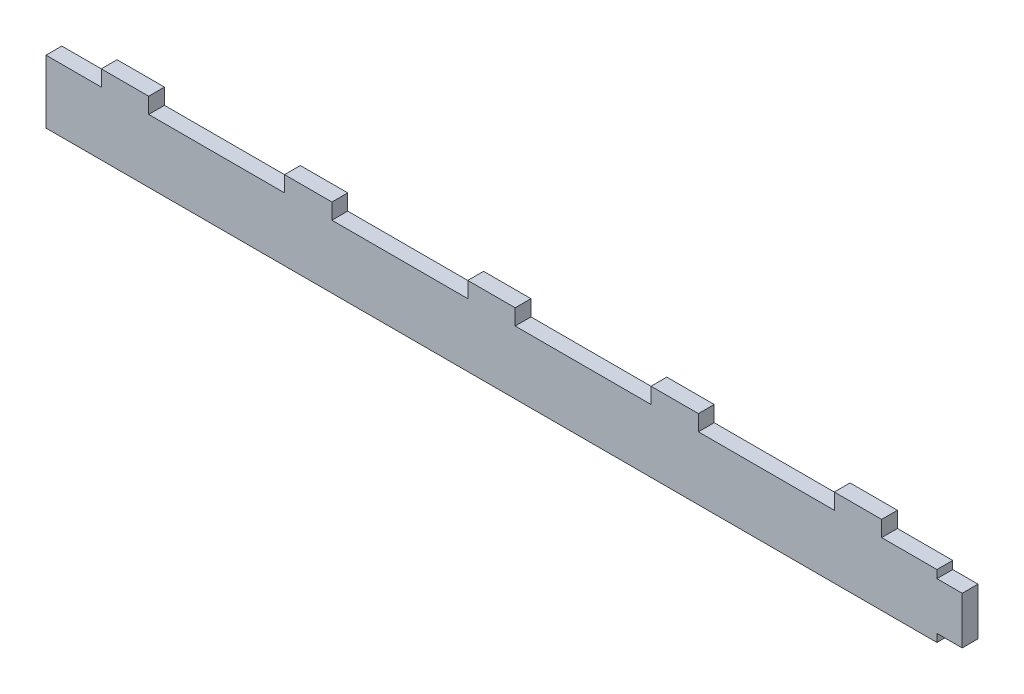
ISO-10303-21;
HEADER;
FILE_DESCRIPTION(('STEP AP214'),'2;1');
FILE_NAME('part.step','',(''),(''),'','','');
FILE_SCHEMA(('AUTOMOTIVE_DESIGN { 1 0 10303 214 1 1 1 1 }'));
ENDSEC;
DATA;
#1=APPLICATION_CONTEXT('core data for automotive mechanical design processes');
#2=APPLICATION_PROTOCOL_DEFINITION('international standard','automotive_design',2000,#1);
#3=PRODUCT_CONTEXT('',#1,'mechanical');
#4=PRODUCT('Part','Part','',(#3));
#5=PRODUCT_RELATED_PRODUCT_CATEGORY('part','',(#4));
#6=PRODUCT_DEFINITION_FORMATION('','',#4);
#7=PRODUCT_DEFINITION_CONTEXT('part definition',#1,'design');
#8=PRODUCT_DEFINITION('design','',#6,#7);
#9=PRODUCT_DEFINITION_SHAPE('','',#8);
#10=(LENGTH_UNIT() NAMED_UNIT(*) SI_UNIT(.MILLI.,.METRE.));
#11=(NAMED_UNIT(*) PLANE_ANGLE_UNIT() SI_UNIT($,.RADIAN.));
#12=(NAMED_UNIT(*) SI_UNIT($,.STERADIAN.) SOLID_ANGLE_UNIT());
#13=UNCERTAINTY_MEASURE_WITH_UNIT(LENGTH_MEASURE(1.E-05),#10,'distance_accuracy_value','');
#14=(GEOMETRIC_REPRESENTATION_CONTEXT(3) GLOBAL_UNCERTAINTY_ASSIGNED_CONTEXT((#13)) GLOBAL_UNIT_ASSIGNED_CONTEXT((#10,
#11,#12)) REPRESENTATION_CONTEXT('',''));
#15=CARTESIAN_POINT('',(0.,0.,0.));
#16=DIRECTION('',(0.,0.,1.));
#17=DIRECTION('',(1.,0.,0.));
#18=AXIS2_PLACEMENT_3D('',#15,#16,#17);
#19=CARTESIAN_POINT('',(0.,42.9416147491288,5.));
#20=DIRECTION('',(0.,1.,0.));
#21=DIRECTION('',(-1.,0.,0.));
#22=AXIS2_PLACEMENT_3D('',#19,#20,#21);
#23=PLANE('',#22);
#24=DIRECTION('',(1.,0.,0.));
#25=VECTOR('',#24,1.);
#26=CARTESIAN_POINT('',(0.,42.9416147491288,0.));
#27=LINE('',#26,#25);
#28=CARTESIAN_POINT('',(-109.795634555167,42.9416147491288,0.));
#29=VERTEX_POINT('',#28);
#30=CARTESIAN_POINT('',(172.204365444833,42.9416147491287,0.));
#31=VERTEX_POINT('',#30);
#32=EDGE_CURVE('E250',#29,#31,#27,.T.);
#33=ORIENTED_EDGE('',*,*,#32,.T.);
#34=DIRECTION('',(0.,0.,-1.));
#35=VECTOR('',#34,1.);
#36=CARTESIAN_POINT('',(172.204365444833,42.9416147491287,5.));
#37=LINE('',#36,#35);
#38=CARTESIAN_POINT('',(172.204365444833,42.9416147491287,5.));
#39=VERTEX_POINT('',#38);
#40=EDGE_CURVE('E11',#39,#31,#37,.T.);
#41=ORIENTED_EDGE('',*,*,#40,.F.);
#42=DIRECTION('',(1.,0.,0.));
#43=VECTOR('',#42,1.);
#44=CARTESIAN_POINT('',(0.,42.9416147491288,5.));
#45=LINE('',#44,#43);
#46=CARTESIAN_POINT('',(-109.795634555167,42.9416147491288,5.));
#47=VERTEX_POINT('',#46);
#48=EDGE_CURVE('E321',#47,#39,#45,.T.);
#49=ORIENTED_EDGE('',*,*,#48,.F.);
#50=DIRECTION('',(0.,0.,-1.));
#51=VECTOR('',#50,1.);
#52=CARTESIAN_POINT('',(-109.795634555167,42.9416147491288,5.));
#53=LINE('',#52,#51);
#54=EDGE_CURVE('E246',#47,#29,#53,.T.);
#55=ORIENTED_EDGE('',*,*,#54,.T.);
#56=EDGE_LOOP('',(#33,#41,#49,#55));
#57=FACE_BOUND('',#56,.T.);
#58=ADVANCED_FACE('F35',(#57),#23,.F.);
#59=CARTESIAN_POINT('',(172.204365444834,1.9118525145781E-12,5.));
#60=DIRECTION('',(-1.,0.,0.));
#61=DIRECTION('',(0.,-1.,0.));
#62=AXIS2_PLACEMENT_3D('',#59,#60,#61);
#63=PLANE('',#62);
#64=DIRECTION('',(0.,1.,0.));
#65=VECTOR('',#64,1.);
#66=CARTESIAN_POINT('',(172.204365444834,1.9118525145781E-12,0.));
#67=LINE('',#66,#65);
#68=CARTESIAN_POINT('',(172.204365444833,45.4416147491288,0.));
#69=VERTEX_POINT('',#68);
#70=EDGE_CURVE('E253',#31,#69,#67,.T.);
#71=ORIENTED_EDGE('',*,*,#70,.T.);
#72=DIRECTION('',(0.,0.,-1.));
#73=VECTOR('',#72,1.);
#74=CARTESIAN_POINT('',(172.204365444833,45.4416147491288,5.));
#75=LINE('',#74,#73);
#76=CARTESIAN_POINT('',(172.204365444833,45.4416147491288,5.));
#77=VERTEX_POINT('',#76);
#78=EDGE_CURVE('E43',#77,#69,#75,.T.);
#79=ORIENTED_EDGE('',*,*,#78,.F.);
#80=DIRECTION('',(0.,1.,0.));
#81=VECTOR('',#80,1.);
#82=CARTESIAN_POINT('',(172.204365444834,1.9118525145781E-12,5.));
#83=LINE('',#82,#81);
#84=EDGE_CURVE('E150',#39,#77,#83,.T.);
#85=ORIENTED_EDGE('',*,*,#84,.F.);
#86=ORIENTED_EDGE('',*,*,#40,.T.);
#87=EDGE_LOOP('',(#71,#79,#85,#86));
#88=FACE_BOUND('',#87,.T.);
#89=ADVANCED_FACE('F374',(#88),#63,.F.);
#90=CARTESIAN_POINT('',(0.,45.4416147491288,5.));
#91=DIRECTION('',(0.,-1.,0.));
#92=DIRECTION('',(0.,0.,-1.));
#93=AXIS2_PLACEMENT_3D('',#90,#91,#92);
#94=PLANE('',#93);
#95=DIRECTION('',(-1.,0.,0.));
#96=VECTOR('',#95,1.);
#97=CARTESIAN_POINT('',(0.,45.4416147491288,0.));
#98=LINE('',#97,#96);
#99=CARTESIAN_POINT('',(180.204365444833,45.4416147491288,0.));
#100=VERTEX_POINT('',#99);
#101=EDGE_CURVE('E256',#100,#69,#98,.T.);
#102=ORIENTED_EDGE('',*,*,#101,.F.);
#103=DIRECTION('',(0.,0.,-1.));
#104=VECTOR('',#103,1.);
#105=CARTESIAN_POINT('',(180.204365444833,45.4416147491288,5.));
#106=LINE('',#105,#104);
#107=CARTESIAN_POINT('',(180.204365444833,45.4416147491288,5.));
#108=VERTEX_POINT('',#107);
#109=EDGE_CURVE('E367',#108,#100,#106,.T.);
#110=ORIENTED_EDGE('',*,*,#109,.F.);
#111=DIRECTION('',(-1.,0.,0.));
#112=VECTOR('',#111,1.);
#113=CARTESIAN_POINT('',(0.,45.4416147491288,5.));
#114=LINE('',#113,#112);
#115=EDGE_CURVE('E373',#108,#77,#114,.T.);
#116=ORIENTED_EDGE('',*,*,#115,.T.);
#117=ORIENTED_EDGE('',*,*,#78,.T.);
#118=EDGE_LOOP('',(#102,#110,#116,#117));
#119=FACE_BOUND('',#118,.T.);
#120=ADVANCED_FACE('F371',(#119),#94,.T.);
#121=CARTESIAN_POINT('',(180.204365444833,0.,5.));
#122=DIRECTION('',(1.,0.,0.));
#123=DIRECTION('',(0.,0.,-1.));
#124=AXIS2_PLACEMENT_3D('',#121,#122,#123);
#125=PLANE('',#124);
#126=DIRECTION('',(0.,-1.,0.));
#127=VECTOR('',#126,1.);
#128=CARTESIAN_POINT('',(180.204365444833,0.,0.));
#129=LINE('',#128,#127);
#130=CARTESIAN_POINT('',(180.204365444833,60.4416147491288,0.));
#131=VERTEX_POINT('',#130);
#132=EDGE_CURVE('E259',#131,#100,#129,.T.);
#133=ORIENTED_EDGE('',*,*,#132,.F.);
#134=DIRECTION('',(0.,0.,-1.));
#135=VECTOR('',#134,1.);
#136=CARTESIAN_POINT('',(180.204365444833,60.4416147491288,5.));
#137=LINE('',#136,#135);
#138=CARTESIAN_POINT('',(180.204365444833,60.4416147491288,5.));
#139=VERTEX_POINT('',#138);
#140=EDGE_CURVE('E365',#139,#131,#137,.T.);
#141=ORIENTED_EDGE('',*,*,#140,.F.);
#142=DIRECTION('',(0.,-1.,0.));
#143=VECTOR('',#142,1.);
#144=CARTESIAN_POINT('',(180.204365444833,0.,5.));
#145=LINE('',#144,#143);
#146=EDGE_CURVE('E386',#139,#108,#145,.T.);
#147=ORIENTED_EDGE('',*,*,#146,.T.);
#148=ORIENTED_EDGE('',*,*,#109,.T.);
#149=EDGE_LOOP('',(#133,#141,#147,#148));
#150=FACE_BOUND('',#149,.T.);
#151=ADVANCED_FACE('F382',(#150),#125,.T.);
#152=CARTESIAN_POINT('',(0.,60.4416147491286,5.));
#153=DIRECTION('',(0.,-1.,0.));
#154=DIRECTION('',(1.,0.,0.));
#155=AXIS2_PLACEMENT_3D('',#152,#153,#154);
#156=PLANE('',#155);
#157=DIRECTION('',(-1.,0.,0.));
#158=VECTOR('',#157,1.);
#159=CARTESIAN_POINT('',(0.,60.4416147491286,0.));
#160=LINE('',#159,#158);
#161=CARTESIAN_POINT('',(172.204365444833,60.4416147491288,0.));
#162=VERTEX_POINT('',#161);
#163=EDGE_CURVE('E262',#131,#162,#160,.T.);
#164=ORIENTED_EDGE('',*,*,#163,.T.);
#165=DIRECTION('',(0.,0.,-1.));
#166=VECTOR('',#165,1.);
#167=CARTESIAN_POINT('',(172.204365444833,60.4416147491288,5.));
#168=LINE('',#167,#166);
#169=CARTESIAN_POINT('',(172.204365444833,60.4416147491288,5.));
#170=VERTEX_POINT('',#169);
#171=EDGE_CURVE('E363',#170,#162,#168,.T.);
#172=ORIENTED_EDGE('',*,*,#171,.F.);
#173=DIRECTION('',(-1.,0.,0.));
#174=VECTOR('',#173,1.);
#175=CARTESIAN_POINT('',(0.,60.4416147491286,5.));
#176=LINE('',#175,#174);
#177=EDGE_CURVE('E388',#139,#170,#176,.T.);
#178=ORIENTED_EDGE('',*,*,#177,.F.);
#179=ORIENTED_EDGE('',*,*,#140,.T.);
#180=EDGE_LOOP('',(#164,#172,#178,#179));
#181=FACE_BOUND('',#180,.T.);
#182=ADVANCED_FACE('F707',(#181),#156,.F.);
#183=CARTESIAN_POINT('',(172.204365444833,0.,5.));
#184=DIRECTION('',(1.,0.,0.));
#185=DIRECTION('',(0.,0.,-1.));
#186=AXIS2_PLACEMENT_3D('',#183,#184,#185);
#187=PLANE('',#186);
#188=DIRECTION('',(0.,-1.,0.));
#189=VECTOR('',#188,1.);
#190=CARTESIAN_POINT('',(172.204365444833,0.,0.));
#191=LINE('',#190,#189);
#192=CARTESIAN_POINT('',(172.204365444833,62.9416147491288,0.));
#193=VERTEX_POINT('',#192);
#194=EDGE_CURVE('E265',#193,#162,#191,.T.);
#195=ORIENTED_EDGE('',*,*,#194,.F.);
#196=DIRECTION('',(0.,0.,-1.));
#197=VECTOR('',#196,1.);
#198=CARTESIAN_POINT('',(172.204365444833,62.9416147491288,5.));
#199=LINE('',#198,#197);
#200=CARTESIAN_POINT('',(172.204365444833,62.9416147491288,5.));
#201=VERTEX_POINT('',#200);
#202=EDGE_CURVE('E361',#201,#193,#199,.T.);
#203=ORIENTED_EDGE('',*,*,#202,.F.);
#204=DIRECTION('',(0.,-1.,0.));
#205=VECTOR('',#204,1.);
#206=CARTESIAN_POINT('',(172.204365444833,0.,5.));
#207=LINE('',#206,#205);
#208=EDGE_CURVE('E394',#201,#170,#207,.T.);
#209=ORIENTED_EDGE('',*,*,#208,.T.);
#210=ORIENTED_EDGE('',*,*,#171,.T.);
#211=EDGE_LOOP('',(#195,#203,#209,#210));
#212=FACE_BOUND('',#211,.T.);
#213=ADVANCED_FACE('F698',(#212),#187,.T.);
#214=CARTESIAN_POINT('',(0.,62.9416147491288,5.));
#215=DIRECTION('',(0.,1.,0.));
#216=DIRECTION('',(0.,0.,1.));
#217=AXIS2_PLACEMENT_3D('',#214,#215,#216);
#218=PLANE('',#217);
#219=DIRECTION('',(1.,0.,0.));
#220=VECTOR('',#219,1.);
#221=CARTESIAN_POINT('',(0.,62.9416147491288,0.));
#222=LINE('',#221,#220);
#223=CARTESIAN_POINT('',(154.704365444833,62.9416147491288,0.));
#224=VERTEX_POINT('',#223);
#225=EDGE_CURVE('E268',#224,#193,#222,.T.);
#226=ORIENTED_EDGE('',*,*,#225,.F.);
#227=DIRECTION('',(0.,0.,-1.));
#228=VECTOR('',#227,1.);
#229=CARTESIAN_POINT('',(154.704365444833,62.9416147491288,5.));
#230=LINE('',#229,#228);
#231=CARTESIAN_POINT('',(154.704365444833,62.9416147491288,5.));
#232=VERTEX_POINT('',#231);
#233=EDGE_CURVE('E359',#232,#224,#230,.T.);
#234=ORIENTED_EDGE('',*,*,#233,.F.);
#235=DIRECTION('',(1.,0.,0.));
#236=VECTOR('',#235,1.);
#237=CARTESIAN_POINT('',(0.,62.9416147491288,5.));
#238=LINE('',#237,#236);
#239=EDGE_CURVE('E397',#232,#201,#238,.T.);
#240=ORIENTED_EDGE('',*,*,#239,.T.);
#241=ORIENTED_EDGE('',*,*,#202,.T.);
#242=EDGE_LOOP('',(#226,#234,#240,#241));
#243=FACE_BOUND('',#242,.T.);
#244=ADVANCED_FACE('F689',(#243),#218,.T.);
#245=CARTESIAN_POINT('',(154.704365444833,-8.58781742634389E-13,5.));
#246=DIRECTION('',(1.,0.,0.));
#247=DIRECTION('',(0.,1.,0.));
#248=AXIS2_PLACEMENT_3D('',#245,#246,#247);
#249=PLANE('',#248);
#250=DIRECTION('',(0.,-1.,0.));
#251=VECTOR('',#250,1.);
#252=CARTESIAN_POINT('',(154.704365444833,-8.58781742634389E-13,0.));
#253=LINE('',#252,#251);
#254=CARTESIAN_POINT('',(154.704365444833,67.9416147491288,0.));
#255=VERTEX_POINT('',#254);
#256=EDGE_CURVE('E271',#255,#224,#253,.T.);
#257=ORIENTED_EDGE('',*,*,#256,.F.);
#258=DIRECTION('',(0.,0.,-1.));
#259=VECTOR('',#258,1.);
#260=CARTESIAN_POINT('',(154.704365444833,67.9416147491288,5.));
#261=LINE('',#260,#259);
#262=CARTESIAN_POINT('',(154.704365444833,67.9416147491288,5.));
#263=VERTEX_POINT('',#262);
#264=EDGE_CURVE('E357',#263,#255,#261,.T.);
#265=ORIENTED_EDGE('',*,*,#264,.F.);
#266=DIRECTION('',(0.,-1.,0.));
#267=VECTOR('',#266,1.);
#268=CARTESIAN_POINT('',(154.704365444833,-8.58781742634389E-13,5.));
#269=LINE('',#268,#267);
#270=EDGE_CURVE('E400',#263,#232,#269,.T.);
#271=ORIENTED_EDGE('',*,*,#270,.T.);
#272=ORIENTED_EDGE('',*,*,#233,.T.);
#273=EDGE_LOOP('',(#257,#265,#271,#272));
#274=FACE_BOUND('',#273,.T.);
#275=ADVANCED_FACE('F681',(#274),#249,.T.);
#276=CARTESIAN_POINT('',(0.,67.9416147491288,5.));
#277=DIRECTION('',(0.,1.,0.));
#278=DIRECTION('',(0.,0.,1.));
#279=AXIS2_PLACEMENT_3D('',#276,#277,#278);
#280=PLANE('',#279);
#281=DIRECTION('',(1.,0.,0.));
#282=VECTOR('',#281,1.);
#283=CARTESIAN_POINT('',(0.,67.9416147491288,0.));
#284=LINE('',#283,#282);
#285=CARTESIAN_POINT('',(139.704365444833,67.9416147491288,0.));
#286=VERTEX_POINT('',#285);
#287=EDGE_CURVE('E274',#286,#255,#284,.T.);
#288=ORIENTED_EDGE('',*,*,#287,.F.);
#289=DIRECTION('',(0.,0.,-1.));
#290=VECTOR('',#289,1.);
#291=CARTESIAN_POINT('',(139.704365444833,67.9416147491288,5.));
#292=LINE('',#291,#290);
#293=CARTESIAN_POINT('',(139.704365444833,67.9416147491288,5.));
#294=VERTEX_POINT('',#293);
#295=EDGE_CURVE('E355',#294,#286,#292,.T.);
#296=ORIENTED_EDGE('',*,*,#295,.F.);
#297=DIRECTION('',(1.,0.,0.));
#298=VECTOR('',#297,1.);
#299=CARTESIAN_POINT('',(0.,67.9416147491288,5.));
#300=LINE('',#299,#298);
#301=EDGE_CURVE('E403',#294,#263,#300,.T.);
#302=ORIENTED_EDGE('',*,*,#301,.T.);
#303=ORIENTED_EDGE('',*,*,#264,.T.);
#304=EDGE_LOOP('',(#288,#296,#302,#303));
#305=FACE_BOUND('',#304,.T.);
#306=ADVANCED_FACE('F512',(#305),#280,.T.);
#307=CARTESIAN_POINT('',(139.704365444833,0.,5.));
#308=DIRECTION('',(1.,0.,0.));
#309=DIRECTION('',(0.,0.,-1.));
#310=AXIS2_PLACEMENT_3D('',#307,#308,#309);
#311=PLANE('',#310);
#312=DIRECTION('',(0.,-1.,0.));
#313=VECTOR('',#312,1.);
#314=CARTESIAN_POINT('',(139.704365444833,0.,0.));
#315=LINE('',#314,#313);
#316=CARTESIAN_POINT('',(139.704365444833,62.9416147491288,0.));
#317=VERTEX_POINT('',#316);
#318=EDGE_CURVE('E277',#286,#317,#315,.T.);
#319=ORIENTED_EDGE('',*,*,#318,.T.);
#320=DIRECTION('',(0.,0.,-1.));
#321=VECTOR('',#320,1.);
#322=CARTESIAN_POINT('',(139.704365444833,62.9416147491288,5.));
#323=LINE('',#322,#321);
#324=CARTESIAN_POINT('',(139.704365444833,62.9416147491288,5.));
#325=VERTEX_POINT('',#324);
#326=EDGE_CURVE('E353',#325,#317,#323,.T.);
#327=ORIENTED_EDGE('',*,*,#326,.F.);
#328=DIRECTION('',(0.,-1.,0.));
#329=VECTOR('',#328,1.);
#330=CARTESIAN_POINT('',(139.704365444833,0.,5.));
#331=LINE('',#330,#329);
#332=EDGE_CURVE('E406',#294,#325,#331,.T.);
#333=ORIENTED_EDGE('',*,*,#332,.F.);
#334=ORIENTED_EDGE('',*,*,#295,.T.);
#335=EDGE_LOOP('',(#319,#327,#333,#334));
#336=FACE_BOUND('',#335,.T.);
#337=ADVANCED_FACE('F664',(#336),#311,.F.);
#338=CARTESIAN_POINT('',(0.,62.9416147491288,5.));
#339=DIRECTION('',(0.,1.,0.));
#340=DIRECTION('',(0.,0.,1.));
#341=AXIS2_PLACEMENT_3D('',#338,#339,#340);
#342=PLANE('',#341);
#343=DIRECTION('',(1.,0.,0.));
#344=VECTOR('',#343,1.);
#345=CARTESIAN_POINT('',(0.,62.9416147491288,0.));
#346=LINE('',#345,#344);
#347=CARTESIAN_POINT('',(96.7043654448333,62.9416147491288,0.));
#348=VERTEX_POINT('',#347);
#349=EDGE_CURVE('E282',#348,#317,#346,.T.);
#350=ORIENTED_EDGE('',*,*,#349,.F.);
#351=DIRECTION('',(0.,0.,-1.));
#352=VECTOR('',#351,1.);
#353=CARTESIAN_POINT('',(96.7043654448333,62.9416147491288,5.));
#354=LINE('',#353,#352);
#355=CARTESIAN_POINT('',(96.7043654448333,62.9416147491288,5.));
#356=VERTEX_POINT('',#355);
#357=EDGE_CURVE('E351',#356,#348,#354,.T.);
#358=ORIENTED_EDGE('',*,*,#357,.F.);
#359=DIRECTION('',(1.,0.,0.));
#360=VECTOR('',#359,1.);
#361=CARTESIAN_POINT('',(0.,62.9416147491288,5.));
#362=LINE('',#361,#360);
#363=EDGE_CURVE('E409',#356,#325,#362,.T.);
#364=ORIENTED_EDGE('',*,*,#363,.T.);
#365=ORIENTED_EDGE('',*,*,#326,.T.);
#366=EDGE_LOOP('',(#350,#358,#364,#365));
#367=FACE_BOUND('',#366,.T.);
#368=ADVANCED_FACE('F657',(#367),#342,.T.);
#369=CARTESIAN_POINT('',(96.7043654448335,2.68408532746549E-13,5.));
#370=DIRECTION('',(1.,0.,0.));
#371=DIRECTION('',(0.,1.,0.));
#372=AXIS2_PLACEMENT_3D('',#369,#370,#371);
#373=PLANE('',#372);
#374=DIRECTION('',(0.,-1.,0.));
#375=VECTOR('',#374,1.);
#376=CARTESIAN_POINT('',(96.7043654448335,2.68408532746549E-13,0.));
#377=LINE('',#376,#375);
#378=CARTESIAN_POINT('',(96.7043654448333,67.9416147491288,0.));
#379=VERTEX_POINT('',#378);
#380=EDGE_CURVE('E285',#379,#348,#377,.T.);
#381=ORIENTED_EDGE('',*,*,#380,.F.);
#382=DIRECTION('',(0.,0.,-1.));
#383=VECTOR('',#382,1.);
#384=CARTESIAN_POINT('',(96.7043654448333,67.9416147491288,5.));
#385=LINE('',#384,#383);
#386=CARTESIAN_POINT('',(96.7043654448333,67.9416147491288,5.));
#387=VERTEX_POINT('',#386);
#388=EDGE_CURVE('E349',#387,#379,#385,.T.);
#389=ORIENTED_EDGE('',*,*,#388,.F.);
#390=DIRECTION('',(0.,-1.,0.));
#391=VECTOR('',#390,1.);
#392=CARTESIAN_POINT('',(96.7043654448335,2.68408532746549E-13,5.));
#393=LINE('',#392,#391);
#394=EDGE_CURVE('E412',#387,#356,#393,.T.);
#395=ORIENTED_EDGE('',*,*,#394,.T.);
#396=ORIENTED_EDGE('',*,*,#357,.T.);
#397=EDGE_LOOP('',(#381,#389,#395,#396));
#398=FACE_BOUND('',#397,.T.);
#399=ADVANCED_FACE('F459',(#398),#373,.T.);
#400=CARTESIAN_POINT('',(81.7043654448333,67.9416147491288,0.));
#401=VERTEX_POINT('',#400);
#402=EDGE_CURVE('E279',#401,#379,#284,.T.);
#403=ORIENTED_EDGE('',*,*,#402,.F.);
#404=DIRECTION('',(0.,0.,-1.));
#405=VECTOR('',#404,1.);
#406=CARTESIAN_POINT('',(81.7043654448333,67.9416147491288,5.));
#407=LINE('',#406,#405);
#408=CARTESIAN_POINT('',(81.7043654448333,67.9416147491288,5.));
#409=VERTEX_POINT('',#408);
#410=EDGE_CURVE('E347',#409,#401,#407,.T.);
#411=ORIENTED_EDGE('',*,*,#410,.F.);
#412=EDGE_CURVE('E407',#409,#387,#300,.T.);
#413=ORIENTED_EDGE('',*,*,#412,.T.);
#414=ORIENTED_EDGE('',*,*,#388,.T.);
#415=EDGE_LOOP('',(#403,#411,#413,#414));
#416=FACE_BOUND('',#415,.T.);
#417=ADVANCED_FACE('F451',(#416),#280,.T.);
#418=CARTESIAN_POINT('',(81.7043654448331,-2.26775169323104E-13,5.));
#419=DIRECTION('',(1.,0.,0.));
#420=DIRECTION('',(0.,1.,0.));
#421=AXIS2_PLACEMENT_3D('',#418,#419,#420);
#422=PLANE('',#421);
#423=DIRECTION('',(0.,-1.,0.));
#424=VECTOR('',#423,1.);
#425=CARTESIAN_POINT('',(81.7043654448331,-2.26775169323104E-13,0.));
#426=LINE('',#425,#424);
#427=CARTESIAN_POINT('',(81.7043654448333,62.9416147491288,0.));
#428=VERTEX_POINT('',#427);
#429=EDGE_CURVE('E288',#401,#428,#426,.T.);
#430=ORIENTED_EDGE('',*,*,#429,.T.);
#431=DIRECTION('',(0.,0.,-1.));
#432=VECTOR('',#431,1.);
#433=CARTESIAN_POINT('',(81.7043654448333,62.9416147491288,5.));
#434=LINE('',#433,#432);
#435=CARTESIAN_POINT('',(81.7043654448333,62.9416147491288,5.));
#436=VERTEX_POINT('',#435);
#437=EDGE_CURVE('E345',#436,#428,#434,.T.);
#438=ORIENTED_EDGE('',*,*,#437,.F.);
#439=DIRECTION('',(0.,-1.,0.));
#440=VECTOR('',#439,1.);
#441=CARTESIAN_POINT('',(81.7043654448331,-2.26775169323104E-13,5.));
#442=LINE('',#441,#440);
#443=EDGE_CURVE('E415',#409,#436,#442,.T.);
#444=ORIENTED_EDGE('',*,*,#443,.F.);
#445=ORIENTED_EDGE('',*,*,#410,.T.);
#446=EDGE_LOOP('',(#430,#438,#444,#445));
#447=FACE_BOUND('',#446,.T.);
#448=ADVANCED_FACE('F503',(#447),#422,.F.);
#449=CARTESIAN_POINT('',(0.,62.9416147491288,5.));
#450=DIRECTION('',(0.,1.,0.));
#451=DIRECTION('',(0.,0.,1.));
#452=AXIS2_PLACEMENT_3D('',#449,#450,#451);
#453=PLANE('',#452);
#454=DIRECTION('',(1.,0.,0.));
#455=VECTOR('',#454,1.);
#456=CARTESIAN_POINT('',(0.,62.9416147491288,0.));
#457=LINE('',#456,#455);
#458=CARTESIAN_POINT('',(38.7043654448333,62.9416147491288,0.));
#459=VERTEX_POINT('',#458);
#460=EDGE_CURVE('E291',#459,#428,#457,.T.);
#461=ORIENTED_EDGE('',*,*,#460,.F.);
#462=DIRECTION('',(0.,0.,-1.));
#463=VECTOR('',#462,1.);
#464=CARTESIAN_POINT('',(38.7043654448333,62.9416147491288,5.));
#465=LINE('',#464,#463);
#466=CARTESIAN_POINT('',(38.7043654448333,62.9416147491288,5.));
#467=VERTEX_POINT('',#466);
#468=EDGE_CURVE('E343',#467,#459,#465,.T.);
#469=ORIENTED_EDGE('',*,*,#468,.F.);
#470=DIRECTION('',(1.,0.,0.));
#471=VECTOR('',#470,1.);
#472=CARTESIAN_POINT('',(0.,62.9416147491288,5.));
#473=LINE('',#472,#471);
#474=EDGE_CURVE('E417',#467,#436,#473,.T.);
#475=ORIENTED_EDGE('',*,*,#474,.T.);
#476=ORIENTED_EDGE('',*,*,#437,.T.);
#477=EDGE_LOOP('',(#461,#469,#475,#476));
#478=FACE_BOUND('',#477,.T.);
#479=ADVANCED_FACE('F501',(#478),#453,.T.);
#480=CARTESIAN_POINT('',(38.7043654448333,0.,5.));
#481=DIRECTION('',(1.,0.,0.));
#482=DIRECTION('',(0.,0.,-1.));
#483=AXIS2_PLACEMENT_3D('',#480,#481,#482);
#484=PLANE('',#483);
#485=DIRECTION('',(0.,-1.,0.));
#486=VECTOR('',#485,1.);
#487=CARTESIAN_POINT('',(38.7043654448333,0.,0.));
#488=LINE('',#487,#486);
#489=CARTESIAN_POINT('',(38.7043654448333,67.9416147491288,0.));
#490=VERTEX_POINT('',#489);
#491=EDGE_CURVE('E294',#490,#459,#488,.T.);
#492=ORIENTED_EDGE('',*,*,#491,.F.);
#493=DIRECTION('',(0.,0.,-1.));
#494=VECTOR('',#493,1.);
#495=CARTESIAN_POINT('',(38.7043654448333,67.9416147491288,5.));
#496=LINE('',#495,#494);
#497=CARTESIAN_POINT('',(38.7043654448333,67.9416147491288,5.));
#498=VERTEX_POINT('',#497);
#499=EDGE_CURVE('E341',#498,#490,#496,.T.);
#500=ORIENTED_EDGE('',*,*,#499,.F.);
#501=DIRECTION('',(0.,-1.,0.));
#502=VECTOR('',#501,1.);
#503=CARTESIAN_POINT('',(38.7043654448333,0.,5.));
#504=LINE('',#503,#502);
#505=EDGE_CURVE('E420',#498,#467,#504,.T.);
#506=ORIENTED_EDGE('',*,*,#505,.T.);
#507=ORIENTED_EDGE('',*,*,#468,.T.);
#508=EDGE_LOOP('',(#492,#500,#506,#507));
#509=FACE_BOUND('',#508,.T.);
#510=ADVANCED_FACE('F498',(#509),#484,.T.);
#511=CARTESIAN_POINT('',(23.7043654448333,67.9416147491288,0.));
#512=VERTEX_POINT('',#511);
#513=EDGE_CURVE('E297',#512,#490,#284,.T.);
#514=ORIENTED_EDGE('',*,*,#513,.F.);
#515=DIRECTION('',(0.,0.,-1.));
#516=VECTOR('',#515,1.);
#517=CARTESIAN_POINT('',(23.7043654448333,67.9416147491288,5.));
#518=LINE('',#517,#516);
#519=CARTESIAN_POINT('',(23.7043654448333,67.9416147491288,5.));
#520=VERTEX_POINT('',#519);
#521=EDGE_CURVE('E339',#520,#512,#518,.T.);
#522=ORIENTED_EDGE('',*,*,#521,.F.);
#523=EDGE_CURVE('E423',#520,#498,#300,.T.);
#524=ORIENTED_EDGE('',*,*,#523,.T.);
#525=ORIENTED_EDGE('',*,*,#499,.T.);
#526=EDGE_LOOP('',(#514,#522,#524,#525));
#527=FACE_BOUND('',#526,.T.);
#528=ADVANCED_FACE('F494',(#527),#280,.T.);
#529=CARTESIAN_POINT('',(23.7043654448333,0.,5.));
#530=DIRECTION('',(1.,0.,0.));
#531=DIRECTION('',(0.,0.,-1.));
#532=AXIS2_PLACEMENT_3D('',#529,#530,#531);
#533=PLANE('',#532);
#534=DIRECTION('',(0.,-1.,0.));
#535=VECTOR('',#534,1.);
#536=CARTESIAN_POINT('',(23.7043654448333,0.,0.));
#537=LINE('',#536,#535);
#538=CARTESIAN_POINT('',(23.7043654448333,62.9416147491288,0.));
#539=VERTEX_POINT('',#538);
#540=EDGE_CURVE('E298',#512,#539,#537,.T.);
#541=ORIENTED_EDGE('',*,*,#540,.T.);
#542=DIRECTION('',(0.,0.,-1.));
#543=VECTOR('',#542,1.);
#544=CARTESIAN_POINT('',(23.7043654448333,62.9416147491288,5.));
#545=LINE('',#544,#543);
#546=CARTESIAN_POINT('',(23.7043654448333,62.9416147491288,5.));
#547=VERTEX_POINT('',#546);
#548=EDGE_CURVE('E337',#547,#539,#545,.T.);
#549=ORIENTED_EDGE('',*,*,#548,.F.);
#550=DIRECTION('',(0.,-1.,0.));
#551=VECTOR('',#550,1.);
#552=CARTESIAN_POINT('',(23.7043654448333,0.,5.));
#553=LINE('',#552,#551);
#554=EDGE_CURVE('E424',#520,#547,#553,.T.);
#555=ORIENTED_EDGE('',*,*,#554,.F.);
#556=ORIENTED_EDGE('',*,*,#521,.T.);
#557=EDGE_LOOP('',(#541,#549,#555,#556));
#558=FACE_BOUND('',#557,.T.);
#559=ADVANCED_FACE('F493',(#558),#533,.F.);
#560=CARTESIAN_POINT('',(0.,62.9416147491288,5.));
#561=DIRECTION('',(0.,1.,0.));
#562=DIRECTION('',(0.,0.,1.));
#563=AXIS2_PLACEMENT_3D('',#560,#561,#562);
#564=PLANE('',#563);
#565=DIRECTION('',(1.,0.,0.));
#566=VECTOR('',#565,1.);
#567=CARTESIAN_POINT('',(0.,62.9416147491288,0.));
#568=LINE('',#567,#566);
#569=CARTESIAN_POINT('',(-19.2956345551667,62.9416147491288,0.));
#570=VERTEX_POINT('',#569);
#571=EDGE_CURVE('E301',#570,#539,#568,.T.);
#572=ORIENTED_EDGE('',*,*,#571,.F.);
#573=DIRECTION('',(0.,0.,-1.));
#574=VECTOR('',#573,1.);
#575=CARTESIAN_POINT('',(-19.2956345551667,62.9416147491288,5.));
#576=LINE('',#575,#574);
#577=CARTESIAN_POINT('',(-19.2956345551667,62.9416147491288,5.));
#578=VERTEX_POINT('',#577);
#579=EDGE_CURVE('E335',#578,#570,#576,.T.);
#580=ORIENTED_EDGE('',*,*,#579,.F.);
#581=DIRECTION('',(1.,0.,0.));
#582=VECTOR('',#581,1.);
#583=CARTESIAN_POINT('',(0.,62.9416147491288,5.));
#584=LINE('',#583,#582);
#585=EDGE_CURVE('E426',#578,#547,#584,.T.);
#586=ORIENTED_EDGE('',*,*,#585,.T.);
#587=ORIENTED_EDGE('',*,*,#548,.T.);
#588=EDGE_LOOP('',(#572,#580,#586,#587));
#589=FACE_BOUND('',#588,.T.);
#590=ADVANCED_FACE('F488',(#589),#564,.T.);
#591=CARTESIAN_POINT('',(-19.2956345551666,0.,5.));
#592=DIRECTION('',(1.,0.,0.));
#593=DIRECTION('',(0.,1.,0.));
#594=AXIS2_PLACEMENT_3D('',#591,#592,#593);
#595=PLANE('',#594);
#596=DIRECTION('',(0.,-1.,0.));
#597=VECTOR('',#596,1.);
#598=CARTESIAN_POINT('',(-19.2956345551666,0.,0.));
#599=LINE('',#598,#597);
#600=CARTESIAN_POINT('',(-19.2956345551667,67.9416147491288,0.));
#601=VERTEX_POINT('',#600);
#602=EDGE_CURVE('E304',#601,#570,#599,.T.);
#603=ORIENTED_EDGE('',*,*,#602,.F.);
#604=DIRECTION('',(0.,0.,-1.));
#605=VECTOR('',#604,1.);
#606=CARTESIAN_POINT('',(-19.2956345551667,67.9416147491288,5.));
#607=LINE('',#606,#605);
#608=CARTESIAN_POINT('',(-19.2956345551667,67.9416147491288,5.));
#609=VERTEX_POINT('',#608);
#610=EDGE_CURVE('E333',#609,#601,#607,.T.);
#611=ORIENTED_EDGE('',*,*,#610,.F.);
#612=DIRECTION('',(0.,-1.,0.));
#613=VECTOR('',#612,1.);
#614=CARTESIAN_POINT('',(-19.2956345551666,0.,5.));
#615=LINE('',#614,#613);
#616=EDGE_CURVE('E429',#609,#578,#615,.T.);
#617=ORIENTED_EDGE('',*,*,#616,.T.);
#618=ORIENTED_EDGE('',*,*,#579,.T.);
#619=EDGE_LOOP('',(#603,#611,#617,#618));
#620=FACE_BOUND('',#619,.T.);
#621=ADVANCED_FACE('F485',(#620),#595,.T.);
#622=CARTESIAN_POINT('',(-34.2956345551667,67.9416147491288,0.));
#623=VERTEX_POINT('',#622);
#624=EDGE_CURVE('E307',#623,#601,#284,.T.);
#625=ORIENTED_EDGE('',*,*,#624,.F.);
#626=DIRECTION('',(0.,0.,-1.));
#627=VECTOR('',#626,1.);
#628=CARTESIAN_POINT('',(-34.2956345551667,67.9416147491288,5.));
#629=LINE('',#628,#627);
#630=CARTESIAN_POINT('',(-34.2956345551667,67.9416147491288,5.));
#631=VERTEX_POINT('',#630);
#632=EDGE_CURVE('E331',#631,#623,#629,.T.);
#633=ORIENTED_EDGE('',*,*,#632,.F.);
#634=EDGE_CURVE('E432',#631,#609,#300,.T.);
#635=ORIENTED_EDGE('',*,*,#634,.T.);
#636=ORIENTED_EDGE('',*,*,#610,.T.);
#637=EDGE_LOOP('',(#625,#633,#635,#636));
#638=FACE_BOUND('',#637,.T.);
#639=ADVANCED_FACE('F480',(#638),#280,.T.);
#640=CARTESIAN_POINT('',(-34.2956345551667,0.,5.));
#641=DIRECTION('',(1.,0.,0.));
#642=DIRECTION('',(0.,0.,-1.));
#643=AXIS2_PLACEMENT_3D('',#640,#641,#642);
#644=PLANE('',#643);
#645=DIRECTION('',(0.,-1.,0.));
#646=VECTOR('',#645,1.);
#647=CARTESIAN_POINT('',(-34.2956345551667,0.,0.));
#648=LINE('',#647,#646);
#649=CARTESIAN_POINT('',(-34.2956345551667,62.9416147491288,0.));
#650=VERTEX_POINT('',#649);
#651=EDGE_CURVE('E308',#623,#650,#648,.T.);
#652=ORIENTED_EDGE('',*,*,#651,.T.);
#653=DIRECTION('',(0.,0.,-1.));
#654=VECTOR('',#653,1.);
#655=CARTESIAN_POINT('',(-34.2956345551667,62.9416147491288,5.));
#656=LINE('',#655,#654);
#657=CARTESIAN_POINT('',(-34.2956345551667,62.9416147491288,5.));
#658=VERTEX_POINT('',#657);
#659=EDGE_CURVE('E329',#658,#650,#656,.T.);
#660=ORIENTED_EDGE('',*,*,#659,.F.);
#661=DIRECTION('',(0.,-1.,0.));
#662=VECTOR('',#661,1.);
#663=CARTESIAN_POINT('',(-34.2956345551667,0.,5.));
#664=LINE('',#663,#662);
#665=EDGE_CURVE('E433',#631,#658,#664,.T.);
#666=ORIENTED_EDGE('',*,*,#665,.F.);
#667=ORIENTED_EDGE('',*,*,#632,.T.);
#668=EDGE_LOOP('',(#652,#660,#666,#667));
#669=FACE_BOUND('',#668,.T.);
#670=ADVANCED_FACE('F538',(#669),#644,.F.);
#671=CARTESIAN_POINT('',(0.,62.9416147491288,5.));
#672=DIRECTION('',(0.,1.,0.));
#673=DIRECTION('',(0.,0.,1.));
#674=AXIS2_PLACEMENT_3D('',#671,#672,#673);
#675=PLANE('',#674);
#676=DIRECTION('',(1.,0.,0.));
#677=VECTOR('',#676,1.);
#678=CARTESIAN_POINT('',(0.,62.9416147491288,0.));
#679=LINE('',#678,#677);
#680=CARTESIAN_POINT('',(-77.2956345551667,62.9416147491288,0.));
#681=VERTEX_POINT('',#680);
#682=EDGE_CURVE('E311',#681,#650,#679,.T.);
#683=ORIENTED_EDGE('',*,*,#682,.F.);
#684=DIRECTION('',(0.,0.,-1.));
#685=VECTOR('',#684,1.);
#686=CARTESIAN_POINT('',(-77.2956345551667,62.9416147491288,5.));
#687=LINE('',#686,#685);
#688=CARTESIAN_POINT('',(-77.2956345551667,62.9416147491288,5.));
#689=VERTEX_POINT('',#688);
#690=EDGE_CURVE('E327',#689,#681,#687,.T.);
#691=ORIENTED_EDGE('',*,*,#690,.F.);
#692=DIRECTION('',(1.,0.,0.));
#693=VECTOR('',#692,1.);
#694=CARTESIAN_POINT('',(0.,62.9416147491288,5.));
#695=LINE('',#694,#693);
#696=EDGE_CURVE('E435',#689,#658,#695,.T.);
#697=ORIENTED_EDGE('',*,*,#696,.T.);
#698=ORIENTED_EDGE('',*,*,#659,.T.);
#699=EDGE_LOOP('',(#683,#691,#697,#698));
#700=FACE_BOUND('',#699,.T.);
#701=ADVANCED_FACE('F477',(#700),#675,.T.);
#702=CARTESIAN_POINT('',(-77.2956345551667,0.,5.));
#703=DIRECTION('',(1.,0.,0.));
#704=DIRECTION('',(0.,0.,-1.));
#705=AXIS2_PLACEMENT_3D('',#702,#703,#704);
#706=PLANE('',#705);
#707=DIRECTION('',(0.,-1.,0.));
#708=VECTOR('',#707,1.);
#709=CARTESIAN_POINT('',(-77.2956345551667,0.,0.));
#710=LINE('',#709,#708);
#711=CARTESIAN_POINT('',(-77.2956345551667,67.9416147491288,0.));
#712=VERTEX_POINT('',#711);
#713=EDGE_CURVE('E314',#712,#681,#710,.T.);
#714=ORIENTED_EDGE('',*,*,#713,.F.);
#715=DIRECTION('',(0.,0.,-1.));
#716=VECTOR('',#715,1.);
#717=CARTESIAN_POINT('',(-77.2956345551667,67.9416147491288,5.));
#718=LINE('',#717,#716);
#719=CARTESIAN_POINT('',(-77.2956345551667,67.9416147491288,5.));
#720=VERTEX_POINT('',#719);
#721=EDGE_CURVE('E325',#720,#712,#718,.T.);
#722=ORIENTED_EDGE('',*,*,#721,.F.);
#723=DIRECTION('',(0.,-1.,0.));
#724=VECTOR('',#723,1.);
#725=CARTESIAN_POINT('',(-77.2956345551667,0.,5.));
#726=LINE('',#725,#724);
#727=EDGE_CURVE('E437',#720,#689,#726,.T.);
#728=ORIENTED_EDGE('',*,*,#727,.T.);
#729=ORIENTED_EDGE('',*,*,#690,.T.);
#730=EDGE_LOOP('',(#714,#722,#728,#729));
#731=FACE_BOUND('',#730,.T.);
#732=ADVANCED_FACE('F473',(#731),#706,.T.);
#733=CARTESIAN_POINT('',(-92.2956345551667,67.9416147491288,0.));
#734=VERTEX_POINT('',#733);
#735=EDGE_CURVE('E278',#734,#712,#284,.T.);
#736=ORIENTED_EDGE('',*,*,#735,.F.);
#737=DIRECTION('',(0.,0.,-1.));
#738=VECTOR('',#737,1.);
#739=CARTESIAN_POINT('',(-92.2956345551667,67.9416147491288,5.));
#740=LINE('',#739,#738);
#741=CARTESIAN_POINT('',(-92.2956345551667,67.9416147491288,5.));
#742=VERTEX_POINT('',#741);
#743=EDGE_CURVE('E242',#742,#734,#740,.T.);
#744=ORIENTED_EDGE('',*,*,#743,.F.);
#745=EDGE_CURVE('E231',#742,#720,#300,.T.);
#746=ORIENTED_EDGE('',*,*,#745,.T.);
#747=ORIENTED_EDGE('',*,*,#721,.T.);
#748=EDGE_LOOP('',(#736,#744,#746,#747));
#749=FACE_BOUND('',#748,.T.);
#750=ADVANCED_FACE('F472',(#749),#280,.T.);
#751=CARTESIAN_POINT('',(-92.2956345551667,0.,5.));
#752=DIRECTION('',(1.,0.,0.));
#753=DIRECTION('',(0.,0.,-1.));
#754=AXIS2_PLACEMENT_3D('',#751,#752,#753);
#755=PLANE('',#754);
#756=DIRECTION('',(0.,-1.,0.));
#757=VECTOR('',#756,1.);
#758=CARTESIAN_POINT('',(-92.2956345551667,0.,0.));
#759=LINE('',#758,#757);
#760=CARTESIAN_POINT('',(-92.2956345551667,62.9416147491288,0.));
#761=VERTEX_POINT('',#760);
#762=EDGE_CURVE('E238',#734,#761,#759,.T.);
#763=ORIENTED_EDGE('',*,*,#762,.T.);
#764=DIRECTION('',(0.,0.,-1.));
#765=VECTOR('',#764,1.);
#766=CARTESIAN_POINT('',(-92.2956345551667,62.9416147491288,5.));
#767=LINE('',#766,#765);
#768=CARTESIAN_POINT('',(-92.2956345551667,62.9416147491288,5.));
#769=VERTEX_POINT('',#768);
#770=EDGE_CURVE('E235',#769,#761,#767,.T.);
#771=ORIENTED_EDGE('',*,*,#770,.F.);
#772=DIRECTION('',(0.,-1.,0.));
#773=VECTOR('',#772,1.);
#774=CARTESIAN_POINT('',(-92.2956345551667,0.,5.));
#775=LINE('',#774,#773);
#776=EDGE_CURVE('E224',#742,#769,#775,.T.);
#777=ORIENTED_EDGE('',*,*,#776,.F.);
#778=ORIENTED_EDGE('',*,*,#743,.T.);
#779=EDGE_LOOP('',(#763,#771,#777,#778));
#780=FACE_BOUND('',#779,.T.);
#781=ADVANCED_FACE('F236',(#780),#755,.F.);
#782=CARTESIAN_POINT('',(0.,62.9416147491288,5.));
#783=DIRECTION('',(0.,1.,0.));
#784=DIRECTION('',(0.,0.,1.));
#785=AXIS2_PLACEMENT_3D('',#782,#783,#784);
#786=PLANE('',#785);
#787=DIRECTION('',(1.,0.,0.));
#788=VECTOR('',#787,1.);
#789=CARTESIAN_POINT('',(0.,62.9416147491288,0.));
#790=LINE('',#789,#788);
#791=CARTESIAN_POINT('',(-109.795634555167,62.9416147491288,0.));
#792=VERTEX_POINT('',#791);
#793=EDGE_CURVE('E318',#792,#761,#790,.T.);
#794=ORIENTED_EDGE('',*,*,#793,.F.);
#795=DIRECTION('',(0.,0.,-1.));
#796=VECTOR('',#795,1.);
#797=CARTESIAN_POINT('',(-109.795634555167,62.9416147491288,5.));
#798=LINE('',#797,#796);
#799=CARTESIAN_POINT('',(-109.795634555167,62.9416147491288,5.));
#800=VERTEX_POINT('',#799);
#801=EDGE_CURVE('E139',#800,#792,#798,.T.);
#802=ORIENTED_EDGE('',*,*,#801,.F.);
#803=DIRECTION('',(1.,0.,0.));
#804=VECTOR('',#803,1.);
#805=CARTESIAN_POINT('',(0.,62.9416147491288,5.));
#806=LINE('',#805,#804);
#807=EDGE_CURVE('E228',#800,#769,#806,.T.);
#808=ORIENTED_EDGE('',*,*,#807,.T.);
#809=ORIENTED_EDGE('',*,*,#770,.T.);
#810=EDGE_LOOP('',(#794,#802,#808,#809));
#811=FACE_BOUND('',#810,.T.);
#812=ADVANCED_FACE('F244',(#811),#786,.T.);
#813=CARTESIAN_POINT('',(-109.795634555167,0.,5.));
#814=DIRECTION('',(1.,0.,0.));
#815=DIRECTION('',(0.,1.,0.));
#816=AXIS2_PLACEMENT_3D('',#813,#814,#815);
#817=PLANE('',#816);
#818=DIRECTION('',(0.,-1.,0.));
#819=VECTOR('',#818,1.);
#820=CARTESIAN_POINT('',(-109.795634555167,0.,0.));
#821=LINE('',#820,#819);
#822=EDGE_CURVE('E142',#792,#29,#821,.T.);
#823=ORIENTED_EDGE('',*,*,#822,.T.);
#824=ORIENTED_EDGE('',*,*,#54,.F.);
#825=DIRECTION('',(0.,-1.,0.));
#826=VECTOR('',#825,1.);
#827=CARTESIAN_POINT('',(-109.795634555167,0.,5.));
#828=LINE('',#827,#826);
#829=EDGE_CURVE('E51',#800,#47,#828,.T.);
#830=ORIENTED_EDGE('',*,*,#829,.F.);
#831=ORIENTED_EDGE('',*,*,#801,.T.);
#832=EDGE_LOOP('',(#823,#824,#830,#831));
#833=FACE_BOUND('',#832,.T.);
#834=ADVANCED_FACE('F520',(#833),#817,.F.);
#835=CARTESIAN_POINT('',(0.,0.,5.));
#836=DIRECTION('',(0.,0.,1.));
#837=DIRECTION('',(1.,0.,0.));
#838=AXIS2_PLACEMENT_3D('',#835,#836,#837);
#839=PLANE('',#838);
#840=ORIENTED_EDGE('',*,*,#48,.T.);
#841=ORIENTED_EDGE('',*,*,#84,.T.);
#842=ORIENTED_EDGE('',*,*,#115,.F.);
#843=ORIENTED_EDGE('',*,*,#146,.F.);
#844=ORIENTED_EDGE('',*,*,#177,.T.);
#845=ORIENTED_EDGE('',*,*,#208,.F.);
#846=ORIENTED_EDGE('',*,*,#239,.F.);
#847=ORIENTED_EDGE('',*,*,#270,.F.);
#848=ORIENTED_EDGE('',*,*,#301,.F.);
#849=ORIENTED_EDGE('',*,*,#332,.T.);
#850=ORIENTED_EDGE('',*,*,#363,.F.);
#851=ORIENTED_EDGE('',*,*,#394,.F.);
#852=ORIENTED_EDGE('',*,*,#412,.F.);
#853=ORIENTED_EDGE('',*,*,#443,.T.);
#854=ORIENTED_EDGE('',*,*,#474,.F.);
#855=ORIENTED_EDGE('',*,*,#505,.F.);
#856=ORIENTED_EDGE('',*,*,#523,.F.);
#857=ORIENTED_EDGE('',*,*,#554,.T.);
#858=ORIENTED_EDGE('',*,*,#585,.F.);
#859=ORIENTED_EDGE('',*,*,#616,.F.);
#860=ORIENTED_EDGE('',*,*,#634,.F.);
#861=ORIENTED_EDGE('',*,*,#665,.T.);
#862=ORIENTED_EDGE('',*,*,#696,.F.);
#863=ORIENTED_EDGE('',*,*,#727,.F.);
#864=ORIENTED_EDGE('',*,*,#745,.F.);
#865=ORIENTED_EDGE('',*,*,#776,.T.);
#866=ORIENTED_EDGE('',*,*,#807,.F.);
#867=ORIENTED_EDGE('',*,*,#829,.T.);
#868=EDGE_LOOP('',(#840,#841,#842,#843,#844,#845,#846,#847,#848,#849,#850,#851,#852,#853,#854,
#855,#856,#857,#858,#859,#860,#861,#862,#863,#864,#865,#866,#867));
#869=FACE_BOUND('',#868,.T.);
#870=ADVANCED_FACE('F226',(#869),#839,.T.);
#871=CARTESIAN_POINT('',(0.,0.,0.));
#872=DIRECTION('',(0.,0.,1.));
#873=DIRECTION('',(1.,0.,0.));
#874=AXIS2_PLACEMENT_3D('',#871,#872,#873);
#875=PLANE('',#874);
#876=ORIENTED_EDGE('',*,*,#32,.F.);
#877=ORIENTED_EDGE('',*,*,#822,.F.);
#878=ORIENTED_EDGE('',*,*,#793,.T.);
#879=ORIENTED_EDGE('',*,*,#762,.F.);
#880=ORIENTED_EDGE('',*,*,#735,.T.);
#881=ORIENTED_EDGE('',*,*,#713,.T.);
#882=ORIENTED_EDGE('',*,*,#682,.T.);
#883=ORIENTED_EDGE('',*,*,#651,.F.);
#884=ORIENTED_EDGE('',*,*,#624,.T.);
#885=ORIENTED_EDGE('',*,*,#602,.T.);
#886=ORIENTED_EDGE('',*,*,#571,.T.);
#887=ORIENTED_EDGE('',*,*,#540,.F.);
#888=ORIENTED_EDGE('',*,*,#513,.T.);
#889=ORIENTED_EDGE('',*,*,#491,.T.);
#890=ORIENTED_EDGE('',*,*,#460,.T.);
#891=ORIENTED_EDGE('',*,*,#429,.F.);
#892=ORIENTED_EDGE('',*,*,#402,.T.);
#893=ORIENTED_EDGE('',*,*,#380,.T.);
#894=ORIENTED_EDGE('',*,*,#349,.T.);
#895=ORIENTED_EDGE('',*,*,#318,.F.);
#896=ORIENTED_EDGE('',*,*,#287,.T.);
#897=ORIENTED_EDGE('',*,*,#256,.T.);
#898=ORIENTED_EDGE('',*,*,#225,.T.);
#899=ORIENTED_EDGE('',*,*,#194,.T.);
#900=ORIENTED_EDGE('',*,*,#163,.F.);
#901=ORIENTED_EDGE('',*,*,#132,.T.);
#902=ORIENTED_EDGE('',*,*,#101,.T.);
#903=ORIENTED_EDGE('',*,*,#70,.F.);
#904=EDGE_LOOP('',(#876,#877,#878,#879,#880,#881,#882,#883,#884,#885,#886,#887,#888,#889,#890,
#891,#892,#893,#894,#895,#896,#897,#898,#899,#900,#901,#902,#903));
#905=FACE_BOUND('',#904,.T.);
#906=ADVANCED_FACE('F378',(#905),#875,.F.);
#907=CLOSED_SHELL('',(#58,#89,#120,#151,#182,#213,#244,#275,#306,#337,#368,#399,#417,#448,#479,
#510,#528,#559,#590,#621,#639,#670,#701,#732,#750,#781,#812,#834,#870,#906));
#908=MANIFOLD_SOLID_BREP('B2',#907);
#909=ADVANCED_BREP_SHAPE_REPRESENTATION('',(#18,#908),#14);
#910=SHAPE_DEFINITION_REPRESENTATION(#9,#909);
ENDSEC;
END-ISO-10303-21;
